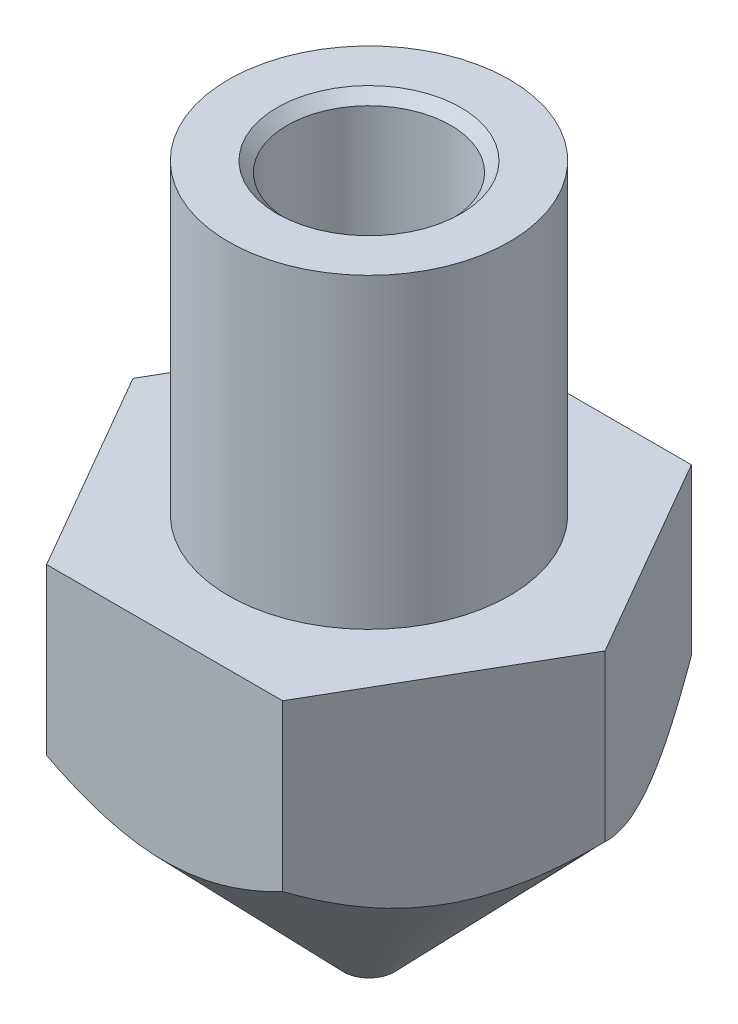
ISO-10303-21;
HEADER;
FILE_DESCRIPTION(('STEP AP214'),'2;1');
FILE_NAME('part.step','',(''),(''),'','','');
FILE_SCHEMA(('AUTOMOTIVE_DESIGN { 1 0 10303 214 1 1 1 1 }'));
ENDSEC;
DATA;
#1=APPLICATION_CONTEXT('core data for automotive mechanical design processes');
#2=APPLICATION_PROTOCOL_DEFINITION('international standard','automotive_design',2000,#1);
#3=PRODUCT_CONTEXT('',#1,'mechanical');
#4=PRODUCT('Part','Part','',(#3));
#5=PRODUCT_RELATED_PRODUCT_CATEGORY('part','',(#4));
#6=PRODUCT_DEFINITION_FORMATION('','',#4);
#7=PRODUCT_DEFINITION_CONTEXT('part definition',#1,'design');
#8=PRODUCT_DEFINITION('design','',#6,#7);
#9=PRODUCT_DEFINITION_SHAPE('','',#8);
#10=(LENGTH_UNIT() NAMED_UNIT(*) SI_UNIT(.MILLI.,.METRE.));
#11=(NAMED_UNIT(*) PLANE_ANGLE_UNIT() SI_UNIT($,.RADIAN.));
#12=(NAMED_UNIT(*) SI_UNIT($,.STERADIAN.) SOLID_ANGLE_UNIT());
#13=UNCERTAINTY_MEASURE_WITH_UNIT(LENGTH_MEASURE(1.E-05),#10,'distance_accuracy_value','');
#14=(GEOMETRIC_REPRESENTATION_CONTEXT(3) GLOBAL_UNCERTAINTY_ASSIGNED_CONTEXT((#13)) GLOBAL_UNIT_ASSIGNED_CONTEXT((#10,
#11,#12)) REPRESENTATION_CONTEXT('',''));
#15=CARTESIAN_POINT('',(0.,0.,0.));
#16=DIRECTION('',(0.,0.,1.));
#17=DIRECTION('',(1.,0.,0.));
#18=AXIS2_PLACEMENT_3D('',#15,#16,#17);
#19=CARTESIAN_POINT('',(0.,0.,0.));
#20=DIRECTION('',(0.,1.,0.));
#21=DIRECTION('',(0.,0.,1.));
#22=AXIS2_PLACEMENT_3D('',#19,#20,#21);
#23=CONICAL_SURFACE('',#22,0.5,0.767944870877507);
#24=CARTESIAN_POINT('',(0.,0.,0.));
#25=DIRECTION('',(0.,-1.,0.));
#26=DIRECTION('',(0.,0.,-1.));
#27=AXIS2_PLACEMENT_3D('',#24,#25,#26);
#28=CIRCLE('',#27,0.5);
#29=CARTESIAN_POINT('',(0.,0.,-0.5));
#30=VERTEX_POINT('',#29);
#31=EDGE_CURVE('E180',#30,#30,#28,.T.);
#32=ORIENTED_EDGE('',*,*,#31,.F.);
#33=EDGE_LOOP('',(#32));
#34=FACE_BOUND('',#33,.T.);
#35=CARTESIAN_POINT('',(-5.83092172087579,6.80451414702023,-4.));
#36=CARTESIAN_POINT('',(-5.71735019996931,6.70754417287104,-4.));
#37=CARTESIAN_POINT('',(-5.60333918837278,6.61108457604268,-4.));
#38=CARTESIAN_POINT('',(-5.37428212111084,6.41938523936363,-4.));
#39=CARTESIAN_POINT('',(-5.25923598782585,6.32414559231196,-4.));
#40=CARTESIAN_POINT('',(-5.02771232762197,6.13488956199301,-4.));
#41=CARTESIAN_POINT('',(-4.91123218432542,6.04087637391336,-4.));
#42=CARTESIAN_POINT('',(-4.67691097801347,5.85456386845405,-4.));
#43=CARTESIAN_POINT('',(-4.5590699417134,5.76226451752297,-4.));
#44=CARTESIAN_POINT('',(-4.31726898726601,5.57622409198879,-4.));
#45=CARTESIAN_POINT('',(-4.19324743657495,5.48256292259419,-4.));
#46=CARTESIAN_POINT('',(-3.94321377460085,5.29793843119599,-4.));
#47=CARTESIAN_POINT('',(-3.81720172723547,5.2069750228323,-4.));
#48=CARTESIAN_POINT('',(-3.56293813164125,5.02844484873786,-4.));
#49=CARTESIAN_POINT('',(-3.43468852451846,4.94087533240978,-4.));
#50=CARTESIAN_POINT('',(-3.17546219551015,4.76988932975329,-4.));
#51=CARTESIAN_POINT('',(-3.04448566807753,4.6864725487278,-4.));
#52=CARTESIAN_POINT('',(-2.76313496282805,4.51500321007929,-4.));
#53=CARTESIAN_POINT('',(-2.61234188100647,4.42762435220452,-4.));
#54=CARTESIAN_POINT('',(-2.30610197398595,4.26152202916953,-4.));
#55=CARTESIAN_POINT('',(-2.15065362770275,4.18280143319145,-4.));
#56=CARTESIAN_POINT('',(-1.67933290496492,3.9652439332767,-4.));
#57=CARTESIAN_POINT('',(-1.35497893301788,3.84273125951961,-4.));
#58=CARTESIAN_POINT('',(-0.927938803833649,3.73331858724004,-4.));
#59=CARTESIAN_POINT('',(-0.833805571152803,3.71228947138424,-4.));
#60=CARTESIAN_POINT('',(-0.644350787560497,3.67664708891024,-4.));
#61=CARTESIAN_POINT('',(-0.549029751182431,3.66203113722843,-4.));
#62=CARTESIAN_POINT('',(-0.353401899052962,3.63922074510874,-4.));
#63=CARTESIAN_POINT('',(-0.253058820458088,3.63133387162626,-4.));
#64=CARTESIAN_POINT('',(-0.0520614584539374,3.62340152273462,-4.));
#65=CARTESIAN_POINT('',(0.0485928199320583,3.62335592140832,-4.));
#66=CARTESIAN_POINT('',(0.249543780217588,3.63110699959155,-4.));
#67=CARTESIAN_POINT('',(0.349840622751916,3.6388995419884,-4.));
#68=CARTESIAN_POINT('',(0.549562272683146,3.66200244367996,-4.));
#69=CARTESIAN_POINT('',(0.648986957434902,3.6773138435781,-4.));
#70=CARTESIAN_POINT('',(0.895443062431706,3.72421614442163,-4.));
#71=CARTESIAN_POINT('',(1.04166200046331,3.76011408004584,-4.));
#72=CARTESIAN_POINT('',(1.33022907239606,3.8450396604516,-4.));
#73=CARTESIAN_POINT('',(1.47257478792436,3.89407530996351,-4.));
#74=CARTESIAN_POINT('',(1.75490117556697,4.00340238370303,-4.));
#75=CARTESIAN_POINT('',(1.89482927233845,4.06382814348894,-4.));
#76=CARTESIAN_POINT('',(2.1016417292314,4.16085298752962,-4.));
#77=CARTESIAN_POINT('',(2.17005832988657,4.19425480912722,-4.));
#78=CARTESIAN_POINT('',(2.30593226081484,4.2629553087002,-4.));
#79=CARTESIAN_POINT('',(2.37338961153632,4.29825394616418,-4.));
#80=CARTESIAN_POINT('',(2.5631025490632,4.40056871932972,-4.));
#81=CARTESIAN_POINT('',(2.68429495937809,4.46955819556944,-4.));
#82=CARTESIAN_POINT('',(2.92400799289134,4.61205124192391,-4.));
#83=CARTESIAN_POINT('',(3.04252806215679,4.68555573638032,-4.));
#84=CARTESIAN_POINT('',(3.27730565688129,4.83626094690872,-4.));
#85=CARTESIAN_POINT('',(3.39356151314026,4.91346425474781,-4.));
#86=CARTESIAN_POINT('',(3.62404017068924,5.07085481246826,-4.));
#87=CARTESIAN_POINT('',(3.73826281309247,5.15104229404955,-4.));
#88=CARTESIAN_POINT('',(4.07923386706226,5.3959326308836,-4.));
#89=CARTESIAN_POINT('',(4.30332491717046,5.5643344519436,-4.));
#90=CARTESIAN_POINT('',(4.74609427839567,5.90786638018397,-4.));
#91=CARTESIAN_POINT('',(4.96477464788648,6.08299386195405,-4.));
#92=CARTESIAN_POINT('',(5.37912326062103,6.42263677002468,-4.));
#93=CARTESIAN_POINT('',(5.57513068079329,6.58673978361731,-4.));
#94=CARTESIAN_POINT('',(5.96449275237983,6.918098815058,-4.));
#95=CARTESIAN_POINT('',(6.15784710285718,7.08535518556491,-4.));
#96=CARTESIAN_POINT('',(6.54062275535227,7.42073543326468,-4.));
#97=CARTESIAN_POINT('',(6.73006391824147,7.5888366960026,-4.));
#98=CARTESIAN_POINT('',(7.10717873878646,7.92693496794005,-4.));
#99=CARTESIAN_POINT('',(7.29485274842942,8.09693158422518,-4.));
#100=CARTESIAN_POINT('',(7.48184847896607,8.26766186002392,-4.));
#101=B_SPLINE_CURVE_WITH_KNOTS('',3,(#35,#36,#37,#38,#39,#40,#41,#42,#43,#44,#45,#46,#47,#48,
#49,#50,#51,#52,#53,#54,#55,#56,#57,#58,#59,#60,#61,#62,#63,#64,#65,#66,#67,#68,#69,#70,#71,#72,
#73,#74,#75,#76,#77,#78,#79,#80,#81,#82,#83,#84,#85,#86,#87,#88,#89,#90,#91,#92,#93,#94,#95,#96,
#97,#98,#99,#100),.UNSPECIFIED.,.F.,.F.,(4,2,2,2,2,2,2,2,2,2,2,2,2,2,2,2,2,2,2,2,2,2,2,2,2,2,2,
2,2,2,2,2,4),(0.,0.448014955500507,0.896063790554634,1.3451100592186,1.79414752771028,
2.26036159191939,2.72656071564975,3.19237374890787,3.65815367868591,4.18069022660586,
4.70339941470861,5.7363308565061,6.02551524403133,6.31457844003722,6.6162374565168,
6.91789162887906,7.21938666627068,7.52092344208241,7.97181746782208,8.42298684783357,
8.87985436823071,9.10823620281689,9.33661316165653,9.75483946538847,10.1731516781548,
10.5917614170776,11.010403726167,11.8511292712344,12.6915299038938,13.4583892828347,
14.2253349390667,14.9851324687841,15.7447753145092),.UNSPECIFIED.);
#102=CARTESIAN_POINT('',(-2.3094010767585,4.26514448647272,-4.));
#103=VERTEX_POINT('',#102);
#104=CARTESIAN_POINT('',(2.3094010767585,4.26514448647272,-4.));
#105=VERTEX_POINT('',#104);
#106=EDGE_CURVE('E122',#103,#105,#101,.T.);
#107=ORIENTED_EDGE('',*,*,#106,.T.);
#108=CARTESIAN_POINT('',(2.30928560670466,4.26526406369767,-4.0002));
#109=CARTESIAN_POINT('',(2.34782211681846,4.22536226357573,-3.93345280653652));
#110=CARTESIAN_POINT('',(2.38666108492066,4.18663148012954,-3.86618174046996));
#111=CARTESIAN_POINT('',(2.46500687081153,4.11186714373337,-3.73048285874805));
#112=CARTESIAN_POINT('',(2.5045140327655,4.07583503606693,-3.66205444698093));
#113=CARTESIAN_POINT('',(2.62451128762482,3.97200066335801,-3.45421310479579));
#114=CARTESIAN_POINT('',(2.70605152011892,3.90891058753372,-3.31298127925504));
#115=CARTESIAN_POINT('',(2.87061839879567,3.79990979509531,-3.02794308414388));
#116=CARTESIAN_POINT('',(2.9536032607487,3.75375117793495,-2.88420908698214));
#117=CARTESIAN_POINT('',(3.12156896494858,3.68124550025721,-2.59328395337886));
#118=CARTESIAN_POINT('',(3.20654416398577,3.65484810835954,-2.44610259126317));
#119=CARTESIAN_POINT('',(3.35177692207373,3.62904173620562,-2.19455207533146));
#120=CARTESIAN_POINT('',(3.41178844602967,3.62390625874003,-2.09060906680015));
#121=CARTESIAN_POINT('',(3.53181335928835,3.62486732352844,-1.88271981886206));
#122=CARTESIAN_POINT('',(3.59182674338555,3.63096735350604,-1.77877358847156));
#123=CARTESIAN_POINT('',(3.71138072489047,3.65407137916736,-1.57170001825789));
#124=CARTESIAN_POINT('',(3.77092074862927,3.67108701840305,-1.46857367205843));
#125=CARTESIAN_POINT('',(3.88905265931392,3.71511269701236,-1.26396320075743));
#126=CARTESIAN_POINT('',(3.94764460982955,3.74212206336837,-1.1624789655498));
#127=CARTESIAN_POINT('',(4.05895017913803,3.80236675521796,-0.969692064342143));
#128=CARTESIAN_POINT('',(4.11175689960454,3.83492463543376,-0.878228141513056));
#129=CARTESIAN_POINT('',(4.21628382691398,3.90643145599088,-0.697182192654049));
#130=CARTESIAN_POINT('',(4.26800375854891,3.9453819936614,-0.607600643298352));
#131=CARTESIAN_POINT('',(4.37022696173718,4.02860468036939,-0.430544861663835));
#132=CARTESIAN_POINT('',(4.42073251326408,4.07286573909606,-0.343066680354955));
#133=CARTESIAN_POINT('',(4.52063120369249,4.16589000797576,-0.170037072923358));
#134=CARTESIAN_POINT('',(4.57002551741183,4.21464815577587,-0.0844836119564646));
#135=CARTESIAN_POINT('',(4.61891762357084,4.26526406369767,0.000200000000000419));
#136=B_SPLINE_CURVE_WITH_KNOTS('',3,(#108,#109,#110,#111,#112,#113,#114,#115,#116,#117,#118,
#119,#120,#121,#122,#123,#124,#125,#126,#127,#128,#129,#130,#131,#132,#133,#134,#135),
.UNSPECIFIED.,.F.,.F.,(4,2,2,2,2,2,2,2,2,2,2,2,2,4),(0.,0.260348804382028,0.520836056824744,
1.04469268588743,1.56054031653382,2.07506958288115,2.43497491323251,2.79499198414201,
3.15539372102648,3.51577119143047,3.84709643355895,4.17850459010681,4.50923231289275,
4.83959217804411),.UNSPECIFIED.);
#137=CARTESIAN_POINT('',(4.61880215351701,4.26514448647272,0.));
#138=VERTEX_POINT('',#137);
#139=EDGE_CURVE('E158',#105,#138,#136,.T.);
#140=ORIENTED_EDGE('',*,*,#139,.T.);
#141=CARTESIAN_POINT('',(4.61891762357084,4.26526406369767,-0.0002));
#142=CARTESIAN_POINT('',(4.58038111345705,4.22536226357573,0.0665471934634804));
#143=CARTESIAN_POINT('',(4.54154214535485,4.18663148012954,0.133818259530037));
#144=CARTESIAN_POINT('',(4.46319635946397,4.11186714373338,0.26951714125195));
#145=CARTESIAN_POINT('',(4.42368919751001,4.07583503606693,0.337945553019075));
#146=CARTESIAN_POINT('',(4.30369194265069,3.97200066335801,0.545786895204212));
#147=CARTESIAN_POINT('',(4.22215171015659,3.90891058753372,0.687018720744959));
#148=CARTESIAN_POINT('',(4.05758483147983,3.79990979509532,0.972056915856126));
#149=CARTESIAN_POINT('',(3.9745999695268,3.75375117793495,1.11579091301787));
#150=CARTESIAN_POINT('',(3.80663426532693,3.68124550025721,1.40671604662114));
#151=CARTESIAN_POINT('',(3.72165906628973,3.65484810835955,1.55389740873683));
#152=CARTESIAN_POINT('',(3.57642630820177,3.62904173620562,1.80544792466854));
#153=CARTESIAN_POINT('',(3.51641478424584,3.62390625874003,1.90939093319985));
#154=CARTESIAN_POINT('',(3.39638987098716,3.62486732352844,2.11728018113794));
#155=CARTESIAN_POINT('',(3.33637648688996,3.63096735350604,2.22122641152844));
#156=CARTESIAN_POINT('',(3.21682250538504,3.65407137916736,2.42829998174211));
#157=CARTESIAN_POINT('',(3.15728248164623,3.67108701840305,2.53142632794157));
#158=CARTESIAN_POINT('',(3.03915057096159,3.71511269701236,2.73603679924257));
#159=CARTESIAN_POINT('',(2.98055862044596,3.74212206336837,2.8375210344502));
#160=CARTESIAN_POINT('',(2.86925305113748,3.80236675521796,3.03030793565786));
#161=CARTESIAN_POINT('',(2.81644633067097,3.83492463543376,3.12177185848695));
#162=CARTESIAN_POINT('',(2.71191940336153,3.90643145599088,3.30281780734595));
#163=CARTESIAN_POINT('',(2.6601994717266,3.9453819936614,3.39239935670165));
#164=CARTESIAN_POINT('',(2.55797626853833,4.02860468036939,3.56945513833616));
#165=CARTESIAN_POINT('',(2.50747071701143,4.07286573909607,3.65693331964504));
#166=CARTESIAN_POINT('',(2.40757202658302,4.16589000797576,3.82996292707664));
#167=CARTESIAN_POINT('',(2.35817771286368,4.21464815577587,3.91551638804353));
#168=CARTESIAN_POINT('',(2.30928560670467,4.26526406369767,4.0002));
#169=B_SPLINE_CURVE_WITH_KNOTS('',3,(#141,#142,#143,#144,#145,#146,#147,#148,#149,#150,#151,
#152,#153,#154,#155,#156,#157,#158,#159,#160,#161,#162,#163,#164,#165,#166,#167,#168),
.UNSPECIFIED.,.F.,.F.,(4,2,2,2,2,2,2,2,2,2,2,2,2,4),(0.,0.260348804382028,0.520836056824744,
1.04469268588743,1.56054031653382,2.07506958288114,2.43497491323251,2.79499198414201,
3.15539372102648,3.51577119143046,3.84709643355895,4.1785045901068,4.50923231289275,
4.8395921780441),.UNSPECIFIED.);
#170=CARTESIAN_POINT('',(2.30940107675851,4.26514448647272,4.));
#171=VERTEX_POINT('',#170);
#172=EDGE_CURVE('E166',#138,#171,#169,.T.);
#173=ORIENTED_EDGE('',*,*,#172,.T.);
#174=CARTESIAN_POINT('',(-5.83092172087579,6.80451414702023,4.));
#175=CARTESIAN_POINT('',(-5.7173501999693,6.70754417287104,4.));
#176=CARTESIAN_POINT('',(-5.60333918837277,6.61108457604267,4.));
#177=CARTESIAN_POINT('',(-5.37428212111083,6.41938523936363,4.));
#178=CARTESIAN_POINT('',(-5.25923598782584,6.32414559231195,4.));
#179=CARTESIAN_POINT('',(-5.02771232762197,6.13488956199301,4.));
#180=CARTESIAN_POINT('',(-4.91123218432542,6.04087637391335,4.));
#181=CARTESIAN_POINT('',(-4.67691097801347,5.85456386845405,4.));
#182=CARTESIAN_POINT('',(-4.5590699417134,5.76226451752297,4.));
#183=CARTESIAN_POINT('',(-4.31726898726601,5.57622409198878,4.));
#184=CARTESIAN_POINT('',(-4.19324743657495,5.48256292259419,4.));
#185=CARTESIAN_POINT('',(-3.94321377460085,5.29793843119599,4.));
#186=CARTESIAN_POINT('',(-3.81720172723546,5.20697502283229,4.));
#187=CARTESIAN_POINT('',(-3.56293813164124,5.02844484873785,4.));
#188=CARTESIAN_POINT('',(-3.43468852451846,4.94087533240978,4.));
#189=CARTESIAN_POINT('',(-3.17546219551015,4.76988932975329,4.));
#190=CARTESIAN_POINT('',(-3.04448566807753,4.6864725487278,4.));
#191=CARTESIAN_POINT('',(-2.76313496282805,4.51500321007929,4.));
#192=CARTESIAN_POINT('',(-2.61234188100647,4.42762435220452,4.));
#193=CARTESIAN_POINT('',(-2.30610197398594,4.26152202916953,4.));
#194=CARTESIAN_POINT('',(-2.15065362770274,4.18280143319145,4.));
#195=CARTESIAN_POINT('',(-1.67933290496492,3.9652439332767,4.));
#196=CARTESIAN_POINT('',(-1.35497893301788,3.84273125951961,4.));
#197=CARTESIAN_POINT('',(-0.927938803833645,3.73331858724003,4.));
#198=CARTESIAN_POINT('',(-0.833805571152798,3.71228947138424,4.));
#199=CARTESIAN_POINT('',(-0.644350787560493,3.67664708891024,4.));
#200=CARTESIAN_POINT('',(-0.549029751182427,3.66203113722843,4.));
#201=CARTESIAN_POINT('',(-0.353401899052958,3.63922074510873,4.));
#202=CARTESIAN_POINT('',(-0.253058820458084,3.63133387162626,4.));
#203=CARTESIAN_POINT('',(-0.0520614584539331,3.62340152273462,4.));
#204=CARTESIAN_POINT('',(0.0485928199320622,3.62335592140831,4.));
#205=CARTESIAN_POINT('',(0.249543780217591,3.63110699959155,4.));
#206=CARTESIAN_POINT('',(0.349840622751919,3.6388995419884,4.));
#207=CARTESIAN_POINT('',(0.54956227268315,3.66200244367996,4.));
#208=CARTESIAN_POINT('',(0.648986957434905,3.6773138435781,4.));
#209=CARTESIAN_POINT('',(0.895443062431709,3.72421614442163,4.));
#210=CARTESIAN_POINT('',(1.04166200046332,3.76011408004584,4.));
#211=CARTESIAN_POINT('',(1.33022907239606,3.8450396604516,4.));
#212=CARTESIAN_POINT('',(1.47257478792437,3.89407530996351,4.));
#213=CARTESIAN_POINT('',(1.75490117556697,4.00340238370303,4.));
#214=CARTESIAN_POINT('',(1.89482927233845,4.06382814348894,4.));
#215=CARTESIAN_POINT('',(2.1016417292314,4.16085298752962,4.));
#216=CARTESIAN_POINT('',(2.17005832988657,4.19425480912722,4.));
#217=CARTESIAN_POINT('',(2.30593226081485,4.2629553087002,4.));
#218=CARTESIAN_POINT('',(2.37338961153632,4.29825394616418,4.));
#219=CARTESIAN_POINT('',(2.5631025490632,4.40056871932972,4.));
#220=CARTESIAN_POINT('',(2.6842949593781,4.46955819556944,4.));
#221=CARTESIAN_POINT('',(2.92400799289134,4.6120512419239,4.));
#222=CARTESIAN_POINT('',(3.04252806215679,4.68555573638032,4.));
#223=CARTESIAN_POINT('',(3.2773056568813,4.83626094690871,4.));
#224=CARTESIAN_POINT('',(3.39356151314027,4.91346425474781,4.));
#225=CARTESIAN_POINT('',(3.62404017068924,5.07085481246826,4.));
#226=CARTESIAN_POINT('',(3.73826281309247,5.15104229404955,4.));
#227=CARTESIAN_POINT('',(4.07923386706226,5.3959326308836,4.));
#228=CARTESIAN_POINT('',(4.30332491717046,5.5643344519436,4.));
#229=CARTESIAN_POINT('',(4.74609427839567,5.90786638018397,4.));
#230=CARTESIAN_POINT('',(4.96477464788648,6.08299386195405,4.));
#231=CARTESIAN_POINT('',(5.37912326062103,6.42263677002468,4.));
#232=CARTESIAN_POINT('',(5.57513068079329,6.5867397836173,4.));
#233=CARTESIAN_POINT('',(5.96449275237983,6.918098815058,4.));
#234=CARTESIAN_POINT('',(6.15784710285718,7.08535518556491,4.));
#235=CARTESIAN_POINT('',(6.54062275535227,7.42073543326468,4.));
#236=CARTESIAN_POINT('',(6.73006391824147,7.5888366960026,4.));
#237=CARTESIAN_POINT('',(7.10717873878646,7.92693496794005,4.));
#238=CARTESIAN_POINT('',(7.29485274842942,8.09693158422518,4.));
#239=CARTESIAN_POINT('',(7.48184847896607,8.26766186002392,4.));
#240=B_SPLINE_CURVE_WITH_KNOTS('',3,(#174,#175,#176,#177,#178,#179,#180,#181,#182,#183,#184,
#185,#186,#187,#188,#189,#190,#191,#192,#193,#194,#195,#196,#197,#198,#199,#200,#201,#202,#203,
#204,#205,#206,#207,#208,#209,#210,#211,#212,#213,#214,#215,#216,#217,#218,#219,#220,#221,#222,
#223,#224,#225,#226,#227,#228,#229,#230,#231,#232,#233,#234,#235,#236,#237,#238,#239),
.UNSPECIFIED.,.F.,.F.,(4,2,2,2,2,2,2,2,2,2,2,2,2,2,2,2,2,2,2,2,2,2,2,2,2,2,2,2,2,2,2,2,4),(0.,
0.448014955500507,0.896063790554633,1.3451100592186,1.79414752771028,2.26036159191938,
2.72656071564975,3.19237374890786,3.65815367868591,4.18069022660586,4.70339941470861,
5.73633085650609,6.02551524403132,6.31457844003722,6.6162374565168,6.91789162887906,
7.21938666627068,7.52092344208241,7.97181746782207,8.42298684783357,8.87985436823071,
9.10823620281689,9.33661316165653,9.75483946538847,10.1731516781548,10.5917614170776,
11.010403726167,11.8511292712344,12.6915299038938,13.4583892828347,14.2253349390667,
14.9851324687841,15.7447753145092),.UNSPECIFIED.);
#241=CARTESIAN_POINT('',(-2.3094010767585,4.26514448647272,4.));
#242=VERTEX_POINT('',#241);
#243=EDGE_CURVE('E212',#171,#242,#240,.F.);
#244=ORIENTED_EDGE('',*,*,#243,.T.);
#245=CARTESIAN_POINT('',(-2.30928560670466,4.26526406369767,4.0002));
#246=CARTESIAN_POINT('',(-2.34782211681846,4.22536226357573,3.93345280653652));
#247=CARTESIAN_POINT('',(-2.38666108492066,4.18663148012954,3.86618174046996));
#248=CARTESIAN_POINT('',(-2.46500687081153,4.11186714373337,3.73048285874805));
#249=CARTESIAN_POINT('',(-2.5045140327655,4.07583503606692,3.66205444698092));
#250=CARTESIAN_POINT('',(-2.62451128762482,3.97200066335801,3.45421310479579));
#251=CARTESIAN_POINT('',(-2.70605152011892,3.90891058753372,3.31298127925504));
#252=CARTESIAN_POINT('',(-2.87061839879567,3.79990979509531,3.02794308414387));
#253=CARTESIAN_POINT('',(-2.95360326074871,3.75375117793495,2.88420908698213));
#254=CARTESIAN_POINT('',(-3.12156896494858,3.68124550025721,2.59328395337886));
#255=CARTESIAN_POINT('',(-3.20654416398577,3.65484810835954,2.44610259126317));
#256=CARTESIAN_POINT('',(-3.35177692207373,3.62904173620561,2.19455207533146));
#257=CARTESIAN_POINT('',(-3.41178844602967,3.62390625874003,2.09060906680015));
#258=CARTESIAN_POINT('',(-3.53181335928835,3.62486732352844,1.88271981886206));
#259=CARTESIAN_POINT('',(-3.59182674338555,3.63096735350604,1.77877358847156));
#260=CARTESIAN_POINT('',(-3.71138072489047,3.65407137916736,1.57170001825789));
#261=CARTESIAN_POINT('',(-3.77092074862928,3.67108701840305,1.46857367205843));
#262=CARTESIAN_POINT('',(-3.88905265931392,3.71511269701236,1.26396320075743));
#263=CARTESIAN_POINT('',(-3.94764460982955,3.74212206336837,1.1624789655498));
#264=CARTESIAN_POINT('',(-4.05895017913803,3.80236675521796,0.969692064342141));
#265=CARTESIAN_POINT('',(-4.11175689960454,3.83492463543376,0.878228141513054));
#266=CARTESIAN_POINT('',(-4.21628382691398,3.90643145599088,0.697182192654048));
#267=CARTESIAN_POINT('',(-4.26800375854891,3.9453819936614,0.607600643298351));
#268=CARTESIAN_POINT('',(-4.37022696173718,4.02860468036939,0.430544861663834));
#269=CARTESIAN_POINT('',(-4.42073251326408,4.07286573909606,0.343066680354955));
#270=CARTESIAN_POINT('',(-4.52063120369249,4.16589000797576,0.170037072923358));
#271=CARTESIAN_POINT('',(-4.57002551741183,4.21464815577587,0.0844836119564646));
#272=CARTESIAN_POINT('',(-4.61891762357084,4.26526406369767,-0.000200000000000437));
#273=B_SPLINE_CURVE_WITH_KNOTS('',3,(#245,#246,#247,#248,#249,#250,#251,#252,#253,#254,#255,
#256,#257,#258,#259,#260,#261,#262,#263,#264,#265,#266,#267,#268,#269,#270,#271,#272),
.UNSPECIFIED.,.F.,.F.,(4,2,2,2,2,2,2,2,2,2,2,2,2,4),(0.,0.260348804382028,0.520836056824745,
1.04469268588743,1.56054031653382,2.07506958288115,2.43497491323251,2.79499198414201,
3.15539372102648,3.51577119143047,3.84709643355895,4.17850459010681,4.50923231289275,
4.83959217804411),.UNSPECIFIED.);
#274=CARTESIAN_POINT('',(-4.61880215351701,4.26514448647272,0.));
#275=VERTEX_POINT('',#274);
#276=EDGE_CURVE('E213',#242,#275,#273,.T.);
#277=ORIENTED_EDGE('',*,*,#276,.T.);
#278=CARTESIAN_POINT('',(-4.61891762357084,4.26526406369767,0.0002));
#279=CARTESIAN_POINT('',(-4.58038111345705,4.22536226357573,-0.0665471934634804));
#280=CARTESIAN_POINT('',(-4.54154214535485,4.18663148012954,-0.133818259530037));
#281=CARTESIAN_POINT('',(-4.46319635946397,4.11186714373338,-0.26951714125195));
#282=CARTESIAN_POINT('',(-4.42368919751001,4.07583503606693,-0.337945553019075));
#283=CARTESIAN_POINT('',(-4.30369194265069,3.97200066335801,-0.545786895204213));
#284=CARTESIAN_POINT('',(-4.22215171015659,3.90891058753372,-0.68701872074496));
#285=CARTESIAN_POINT('',(-4.05758483147983,3.79990979509531,-0.972056915856127));
#286=CARTESIAN_POINT('',(-3.9745999695268,3.75375117793495,-1.11579091301787));
#287=CARTESIAN_POINT('',(-3.80663426532692,3.68124550025721,-1.40671604662114));
#288=CARTESIAN_POINT('',(-3.72165906628973,3.65484810835955,-1.55389740873684));
#289=CARTESIAN_POINT('',(-3.57642630820177,3.62904173620562,-1.80544792466854));
#290=CARTESIAN_POINT('',(-3.51641478424584,3.62390625874003,-1.90939093319986));
#291=CARTESIAN_POINT('',(-3.39638987098716,3.62486732352844,-2.11728018113794));
#292=CARTESIAN_POINT('',(-3.33637648688995,3.63096735350604,-2.22122641152844));
#293=CARTESIAN_POINT('',(-3.21682250538503,3.65407137916736,-2.42829998174212));
#294=CARTESIAN_POINT('',(-3.15728248164623,3.67108701840305,-2.53142632794158));
#295=CARTESIAN_POINT('',(-3.03915057096159,3.71511269701236,-2.73603679924257));
#296=CARTESIAN_POINT('',(-2.98055862044596,3.74212206336837,-2.8375210344502));
#297=CARTESIAN_POINT('',(-2.86925305113748,3.80236675521796,-3.03030793565786));
#298=CARTESIAN_POINT('',(-2.81644633067097,3.83492463543376,-3.12177185848695));
#299=CARTESIAN_POINT('',(-2.71191940336153,3.90643145599088,-3.30281780734595));
#300=CARTESIAN_POINT('',(-2.6601994717266,3.9453819936614,-3.39239935670165));
#301=CARTESIAN_POINT('',(-2.55797626853833,4.02860468036939,-3.56945513833617));
#302=CARTESIAN_POINT('',(-2.50747071701143,4.07286573909606,-3.65693331964505));
#303=CARTESIAN_POINT('',(-2.40757202658302,4.16589000797576,-3.82996292707664));
#304=CARTESIAN_POINT('',(-2.35817771286368,4.21464815577587,-3.91551638804353));
#305=CARTESIAN_POINT('',(-2.30928560670467,4.26526406369767,-4.0002));
#306=B_SPLINE_CURVE_WITH_KNOTS('',3,(#278,#279,#280,#281,#282,#283,#284,#285,#286,#287,#288,
#289,#290,#291,#292,#293,#294,#295,#296,#297,#298,#299,#300,#301,#302,#303,#304,#305),
.UNSPECIFIED.,.F.,.F.,(4,2,2,2,2,2,2,2,2,2,2,2,2,4),(0.,0.260348804382028,0.520836056824745,
1.04469268588743,1.56054031653382,2.07506958288115,2.43497491323251,2.79499198414201,
3.15539372102648,3.51577119143047,3.84709643355895,4.17850459010681,4.50923231289275,
4.8395921780441),.UNSPECIFIED.);
#307=EDGE_CURVE('E92',#275,#103,#306,.T.);
#308=ORIENTED_EDGE('',*,*,#307,.T.);
#309=EDGE_LOOP('',(#107,#140,#173,#244,#277,#308));
#310=FACE_BOUND('',#309,.T.);
#311=ADVANCED_FACE('F36',(#34,#310),#23,.T.);
#312=CARTESIAN_POINT('',(7.74266581105308,7.5,0.));
#313=DIRECTION('',(0.,1.,0.));
#314=DIRECTION('',(0.,0.,1.));
#315=AXIS2_PLACEMENT_3D('',#312,#313,#314);
#316=PLANE('',#315);
#317=CARTESIAN_POINT('',(0.,7.5,0.));
#318=DIRECTION('',(0.,-1.,0.));
#319=DIRECTION('',(0.,0.,-1.));
#320=AXIS2_PLACEMENT_3D('',#317,#318,#319);
#321=CIRCLE('',#320,2.75);
#322=CARTESIAN_POINT('',(0.,7.5,-2.75));
#323=VERTEX_POINT('',#322);
#324=EDGE_CURVE('E177',#323,#323,#321,.T.);
#325=ORIENTED_EDGE('',*,*,#324,.T.);
#326=EDGE_LOOP('',(#325));
#327=FACE_BOUND('',#326,.T.);
#328=DIRECTION('',(0.5,0.,-0.866025403784439));
#329=VECTOR('',#328,1.);
#330=CARTESIAN_POINT('',(2.30940107675851,7.5,4.));
#331=LINE('',#330,#329);
#332=CARTESIAN_POINT('',(2.30940107675851,7.5,4.));
#333=VERTEX_POINT('',#332);
#334=CARTESIAN_POINT('',(4.61880215351701,7.5,0.));
#335=VERTEX_POINT('',#334);
#336=EDGE_CURVE('E118',#333,#335,#331,.T.);
#337=ORIENTED_EDGE('',*,*,#336,.T.);
#338=DIRECTION('',(-0.5,0.,-0.866025403784438));
#339=VECTOR('',#338,1.);
#340=CARTESIAN_POINT('',(4.61880215351701,7.5,0.));
#341=LINE('',#340,#339);
#342=CARTESIAN_POINT('',(2.3094010767585,7.5,-4.));
#343=VERTEX_POINT('',#342);
#344=EDGE_CURVE('E113',#335,#343,#341,.T.);
#345=ORIENTED_EDGE('',*,*,#344,.T.);
#346=DIRECTION('',(-1.,0.,0.));
#347=VECTOR('',#346,1.);
#348=CARTESIAN_POINT('',(2.3094010767585,7.5,-4.));
#349=LINE('',#348,#347);
#350=CARTESIAN_POINT('',(-2.3094010767585,7.5,-4.));
#351=VERTEX_POINT('',#350);
#352=EDGE_CURVE('E111',#343,#351,#349,.T.);
#353=ORIENTED_EDGE('',*,*,#352,.T.);
#354=DIRECTION('',(-0.5,0.,0.866025403784438));
#355=VECTOR('',#354,1.);
#356=CARTESIAN_POINT('',(-2.3094010767585,7.5,-4.));
#357=LINE('',#356,#355);
#358=CARTESIAN_POINT('',(-4.61880215351701,7.5,0.));
#359=VERTEX_POINT('',#358);
#360=EDGE_CURVE('E59',#351,#359,#357,.T.);
#361=ORIENTED_EDGE('',*,*,#360,.T.);
#362=DIRECTION('',(0.500000000000001,0.,0.866025403784438));
#363=VECTOR('',#362,1.);
#364=CARTESIAN_POINT('',(-4.61880215351701,7.5,0.));
#365=LINE('',#364,#363);
#366=CARTESIAN_POINT('',(-2.3094010767585,7.5,4.));
#367=VERTEX_POINT('',#366);
#368=EDGE_CURVE('E99',#359,#367,#365,.T.);
#369=ORIENTED_EDGE('',*,*,#368,.T.);
#370=DIRECTION('',(1.,0.,0.));
#371=VECTOR('',#370,1.);
#372=CARTESIAN_POINT('',(-2.3094010767585,7.5,4.));
#373=LINE('',#372,#371);
#374=EDGE_CURVE('E105',#367,#333,#373,.T.);
#375=ORIENTED_EDGE('',*,*,#374,.T.);
#376=EDGE_LOOP('',(#337,#345,#353,#361,#369,#375));
#377=FACE_BOUND('',#376,.T.);
#378=ADVANCED_FACE('F109',(#327,#377),#316,.T.);
#379=CARTESIAN_POINT('',(0.,2.42487113059646,0.));
#380=DIRECTION('',(0.,1.,0.));
#381=DIRECTION('',(0.,0.,1.));
#382=AXIS2_PLACEMENT_3D('',#379,#380,#381);
#383=CONICAL_SURFACE('',#382,1.6,0.523598775598293);
#384=CARTESIAN_POINT('',(0.,0.,0.));
#385=DIRECTION('',(0.,-1.,0.));
#386=DIRECTION('',(0.,0.,-1.));
#387=AXIS2_PLACEMENT_3D('',#384,#385,#386);
#388=CIRCLE('',#387,0.2);
#389=CARTESIAN_POINT('',(0.,0.,0.2));
#390=VERTEX_POINT('',#389);
#391=EDGE_CURVE('E183',#390,#390,#388,.T.);
#392=CARTESIAN_POINT('',(0.,2.42487113059646,0.));
#393=DIRECTION('',(0.,-1.,0.));
#394=DIRECTION('',(0.,0.,-1.));
#395=AXIS2_PLACEMENT_3D('',#392,#393,#394);
#396=CIRCLE('',#395,1.6);
#397=CARTESIAN_POINT('',(0.,2.42487113059646,1.6));
#398=VERTEX_POINT('',#397);
#399=EDGE_CURVE('E165',#398,#398,#396,.T.);
#400=CARTESIAN_POINT('',(0.,0.,0.2));
#401=CARTESIAN_POINT('',(0.,0.0252590742770464,0.214583333333333));
#402=CARTESIAN_POINT('',(0.,0.0505181485540929,0.229166666666667));
#403=CARTESIAN_POINT('',(0.,0.101036297108186,0.258333333333333));
#404=CARTESIAN_POINT('',(0.,0.126295371385233,0.272916666666667));
#405=CARTESIAN_POINT('',(0.,0.176813519939326,0.302083333333333));
#406=CARTESIAN_POINT('',(0.,0.202072594216372,0.316666666666667));
#407=CARTESIAN_POINT('',(0.,0.252590742770465,0.345833333333333));
#408=CARTESIAN_POINT('',(0.,0.277849817047512,0.360416666666667));
#409=CARTESIAN_POINT('',(0.,0.328367965601605,0.389583333333333));
#410=CARTESIAN_POINT('',(0.,0.353627039878651,0.404166666666667));
#411=CARTESIAN_POINT('',(0.,0.404145188432744,0.433333333333333));
#412=CARTESIAN_POINT('',(0.,0.429404262709791,0.447916666666667));
#413=CARTESIAN_POINT('',(0.,0.479922411263884,0.477083333333333));
#414=CARTESIAN_POINT('',(0.,0.50518148554093,0.491666666666667));
#415=CARTESIAN_POINT('',(0.,0.555699634095023,0.520833333333334));
#416=CARTESIAN_POINT('',(0.,0.58095870837207,0.535416666666667));
#417=CARTESIAN_POINT('',(0.,0.631476856926163,0.564583333333334));
#418=CARTESIAN_POINT('',(0.,0.656735931203209,0.579166666666667));
#419=CARTESIAN_POINT('',(0.,0.707254079757302,0.608333333333334));
#420=CARTESIAN_POINT('',(0.,0.732513154034349,0.622916666666667));
#421=CARTESIAN_POINT('',(0.,0.783031302588442,0.652083333333334));
#422=CARTESIAN_POINT('',(0.,0.808290376865488,0.666666666666667));
#423=CARTESIAN_POINT('',(0.,0.858808525419581,0.695833333333334));
#424=CARTESIAN_POINT('',(0.,0.884067599696628,0.710416666666667));
#425=CARTESIAN_POINT('',(0.,0.934585748250721,0.739583333333334));
#426=CARTESIAN_POINT('',(0.,0.959844822527767,0.754166666666667));
#427=CARTESIAN_POINT('',(0.,1.01036297108186,0.783333333333334));
#428=CARTESIAN_POINT('',(0.,1.03562204535891,0.797916666666667));
#429=CARTESIAN_POINT('',(0.,1.086140193913,0.827083333333334));
#430=CARTESIAN_POINT('',(0.,1.11139926819005,0.841666666666667));
#431=CARTESIAN_POINT('',(0.,1.16191741674414,0.870833333333334));
#432=CARTESIAN_POINT('',(0.,1.18717649102119,0.885416666666667));
#433=CARTESIAN_POINT('',(0.,1.23769463957528,0.914583333333334));
#434=CARTESIAN_POINT('',(0.,1.26295371385233,0.929166666666667));
#435=CARTESIAN_POINT('',(0.,1.31347186240642,0.958333333333334));
#436=CARTESIAN_POINT('',(0.,1.33873093668347,0.972916666666668));
#437=CARTESIAN_POINT('',(0.,1.38924908523756,1.00208333333333));
#438=CARTESIAN_POINT('',(0.,1.4145081595146,1.01666666666667));
#439=CARTESIAN_POINT('',(0.,1.4650263080687,1.04583333333333));
#440=CARTESIAN_POINT('',(0.,1.49028538234574,1.06041666666667));
#441=CARTESIAN_POINT('',(0.,1.54080353089984,1.08958333333333));
#442=CARTESIAN_POINT('',(0.,1.56606260517688,1.10416666666667));
#443=CARTESIAN_POINT('',(0.,1.61658075373098,1.13333333333333));
#444=CARTESIAN_POINT('',(0.,1.64183982800802,1.14791666666667));
#445=CARTESIAN_POINT('',(0.,1.69235797656212,1.17708333333333));
#446=CARTESIAN_POINT('',(0.,1.71761705083916,1.19166666666667));
#447=CARTESIAN_POINT('',(0.,1.76813519939326,1.22083333333333));
#448=CARTESIAN_POINT('',(0.,1.7933942736703,1.23541666666667));
#449=CARTESIAN_POINT('',(0.,1.8439124222244,1.26458333333333));
#450=CARTESIAN_POINT('',(0.,1.86917149650144,1.27916666666667));
#451=CARTESIAN_POINT('',(0.,1.91968964505553,1.30833333333333));
#452=CARTESIAN_POINT('',(0.,1.94494871933258,1.32291666666667));
#453=CARTESIAN_POINT('',(0.,1.99546686788667,1.35208333333333));
#454=CARTESIAN_POINT('',(0.,2.02072594216372,1.36666666666667));
#455=CARTESIAN_POINT('',(0.,2.07124409071781,1.39583333333333));
#456=CARTESIAN_POINT('',(0.,2.09650316499486,1.41041666666667));
#457=CARTESIAN_POINT('',(0.,2.14702131354895,1.43958333333333));
#458=CARTESIAN_POINT('',(0.,2.172280387826,1.45416666666667));
#459=CARTESIAN_POINT('',(0.,2.22279853638009,1.48333333333333));
#460=CARTESIAN_POINT('',(0.,2.24805761065714,1.49791666666667));
#461=CARTESIAN_POINT('',(0.,2.29857575921123,1.52708333333333));
#462=CARTESIAN_POINT('',(0.,2.32383483348828,1.54166666666667));
#463=CARTESIAN_POINT('',(0.,2.37435298204237,1.57083333333333));
#464=CARTESIAN_POINT('',(0.,2.39961205631942,1.58541666666667));
#465=CARTESIAN_POINT('',(0.,2.42487113059646,1.6));
#466=B_SPLINE_CURVE_WITH_KNOTS('',3,(#400,#401,#402,#403,#404,#405,#406,#407,#408,#409,#410,
#411,#412,#413,#414,#415,#416,#417,#418,#419,#420,#421,#422,#423,#424,#425,#426,#427,#428,#429,
#430,#431,#432,#433,#434,#435,#436,#437,#438,#439,#440,#441,#442,#443,#444,#445,#446,#447,#448,
#449,#450,#451,#452,#453,#454,#455,#456,#457,#458,#459,#460,#461,#462,#463,#464,#465),
.UNSPECIFIED.,.F.,.F.,(4,2,2,2,2,2,2,2,2,2,2,2,2,2,2,2,2,2,2,2,2,2,2,2,2,2,2,2,2,2,2,2,4),(0.,
0.0875000000000008,0.175000000000002,0.262500000000003,0.350000000000004,0.437500000000005,
0.525000000000006,0.612500000000007,0.700000000000008,0.787500000000009,0.87500000000001,
0.962500000000011,1.05000000000001,1.13750000000001,1.22500000000001,1.31250000000002,
1.40000000000002,1.48750000000002,1.57500000000002,1.66250000000002,1.75000000000002,
1.83750000000002,1.92500000000002,2.01250000000002,2.10000000000002,2.18750000000003,
2.27500000000003,2.36250000000003,2.45000000000003,2.53750000000003,2.62500000000003,
2.71250000000003,2.80000000000003),.UNSPECIFIED.);
#467=EDGE_CURVE('BSEAM201',#390,#398,#466,.T.);
#468=ORIENTED_EDGE('',*,*,#391,.T.);
#469=ORIENTED_EDGE('',*,*,#399,.F.);
#470=ORIENTED_EDGE('',*,*,#467,.T.);
#471=ORIENTED_EDGE('',*,*,#467,.F.);
#472=EDGE_LOOP('',(#468,#470,#469,#471));
#473=FACE_BOUND('',#472,.T.);
#474=ADVANCED_FACE('F201',(#473),#383,.F.);
#475=CARTESIAN_POINT('',(0.2,0.,0.));
#476=DIRECTION('',(0.,-1.,0.));
#477=DIRECTION('',(0.,0.,-1.));
#478=AXIS2_PLACEMENT_3D('',#475,#476,#477);
#479=PLANE('',#478);
#480=ORIENTED_EDGE('',*,*,#31,.T.);
#481=EDGE_LOOP('',(#480));
#482=FACE_BOUND('',#481,.T.);
#483=ORIENTED_EDGE('',*,*,#391,.F.);
#484=EDGE_LOOP('',(#483));
#485=FACE_BOUND('',#484,.T.);
#486=ADVANCED_FACE('F303',(#482,#485),#479,.T.);
#487=CARTESIAN_POINT('',(0.,0.,0.));
#488=DIRECTION('',(0.,-1.,0.));
#489=DIRECTION('',(0.,0.,-1.));
#490=AXIS2_PLACEMENT_3D('',#487,#488,#489);
#491=CYLINDRICAL_SURFACE('',#490,2.75);
#492=CARTESIAN_POINT('',(0.,13.5,0.));
#493=DIRECTION('',(0.,-1.,0.));
#494=DIRECTION('',(0.,0.,-1.));
#495=AXIS2_PLACEMENT_3D('',#492,#493,#494);
#496=CIRCLE('',#495,2.75);
#497=CARTESIAN_POINT('',(0.,13.5,-2.75));
#498=VERTEX_POINT('',#497);
#499=EDGE_CURVE('E174',#498,#498,#496,.T.);
#500=ORIENTED_EDGE('',*,*,#499,.T.);
#501=EDGE_LOOP('',(#500));
#502=FACE_BOUND('',#501,.T.);
#503=ORIENTED_EDGE('',*,*,#324,.F.);
#504=EDGE_LOOP('',(#503));
#505=FACE_BOUND('',#504,.T.);
#506=ADVANCED_FACE('F247',(#502,#505),#491,.T.);
#507=CARTESIAN_POINT('',(2.75,13.5,0.));
#508=DIRECTION('',(0.,1.,0.));
#509=DIRECTION('',(0.,0.,1.));
#510=AXIS2_PLACEMENT_3D('',#507,#508,#509);
#511=PLANE('',#510);
#512=CARTESIAN_POINT('',(0.,13.5,0.));
#513=DIRECTION('',(0.,1.,0.));
#514=DIRECTION('',(0.,0.,1.));
#515=AXIS2_PLACEMENT_3D('',#512,#513,#514);
#516=CIRCLE('',#515,1.8);
#517=CARTESIAN_POINT('',(0.,13.5,1.8));
#518=VERTEX_POINT('',#517);
#519=EDGE_CURVE('E44',#518,#518,#516,.F.);
#520=ORIENTED_EDGE('',*,*,#519,.T.);
#521=EDGE_LOOP('',(#520));
#522=FACE_BOUND('',#521,.T.);
#523=ORIENTED_EDGE('',*,*,#499,.F.);
#524=EDGE_LOOP('',(#523));
#525=FACE_BOUND('',#524,.T.);
#526=ADVANCED_FACE('F188',(#522,#525),#511,.T.);
#527=CARTESIAN_POINT('',(0.,0.,0.));
#528=DIRECTION('',(0.,-1.,0.));
#529=DIRECTION('',(0.,0.,-1.));
#530=AXIS2_PLACEMENT_3D('',#527,#528,#529);
#531=CYLINDRICAL_SURFACE('',#530,1.6);
#532=CARTESIAN_POINT('',(0.,13.3,0.));
#533=DIRECTION('',(0.,1.,0.));
#534=DIRECTION('',(0.,0.,1.));
#535=AXIS2_PLACEMENT_3D('',#532,#533,#534);
#536=CIRCLE('',#535,1.6);
#537=CARTESIAN_POINT('',(0.,13.3,1.6));
#538=VERTEX_POINT('',#537);
#539=EDGE_CURVE('E11',#538,#538,#536,.T.);
#540=ORIENTED_EDGE('',*,*,#539,.T.);
#541=EDGE_LOOP('',(#540));
#542=FACE_BOUND('',#541,.T.);
#543=ORIENTED_EDGE('',*,*,#399,.T.);
#544=EDGE_LOOP('',(#543));
#545=FACE_BOUND('',#544,.T.);
#546=ADVANCED_FACE('F154',(#542,#545),#531,.F.);
#547=CARTESIAN_POINT('',(4.61880215351701,0.,0.));
#548=DIRECTION('',(0.866025403784438,0.,-0.5));
#549=DIRECTION('',(-0.5,0.,-0.866025403784438));
#550=AXIS2_PLACEMENT_3D('',#547,#548,#549);
#551=PLANE('',#550);
#552=DIRECTION('',(0.,1.,0.));
#553=VECTOR('',#552,1.);
#554=CARTESIAN_POINT('',(2.3094010767585,0.,-4.));
#555=LINE('',#554,#553);
#556=EDGE_CURVE('E51',#105,#343,#555,.T.);
#557=ORIENTED_EDGE('',*,*,#556,.T.);
#558=ORIENTED_EDGE('',*,*,#344,.F.);
#559=DIRECTION('',(0.,1.,0.));
#560=VECTOR('',#559,1.);
#561=CARTESIAN_POINT('',(4.61880215351701,0.,0.));
#562=LINE('',#561,#560);
#563=EDGE_CURVE('E120',#138,#335,#562,.T.);
#564=ORIENTED_EDGE('',*,*,#563,.F.);
#565=ORIENTED_EDGE('',*,*,#139,.F.);
#566=EDGE_LOOP('',(#557,#558,#564,#565));
#567=FACE_BOUND('',#566,.T.);
#568=ADVANCED_FACE('F149',(#567),#551,.T.);
#569=CARTESIAN_POINT('',(2.30940107675851,0.,4.));
#570=DIRECTION('',(0.866025403784439,0.,0.5));
#571=DIRECTION('',(0.5,0.,-0.866025403784439));
#572=AXIS2_PLACEMENT_3D('',#569,#570,#571);
#573=PLANE('',#572);
#574=ORIENTED_EDGE('',*,*,#563,.T.);
#575=ORIENTED_EDGE('',*,*,#336,.F.);
#576=DIRECTION('',(0.,1.,0.));
#577=VECTOR('',#576,1.);
#578=CARTESIAN_POINT('',(2.30940107675851,0.,4.));
#579=LINE('',#578,#577);
#580=EDGE_CURVE('E123',#171,#333,#579,.T.);
#581=ORIENTED_EDGE('',*,*,#580,.F.);
#582=ORIENTED_EDGE('',*,*,#172,.F.);
#583=EDGE_LOOP('',(#574,#575,#581,#582));
#584=FACE_BOUND('',#583,.T.);
#585=ADVANCED_FACE('F153',(#584),#573,.T.);
#586=CARTESIAN_POINT('',(-2.3094010767585,0.,4.));
#587=DIRECTION('',(0.,0.,1.));
#588=DIRECTION('',(1.,0.,0.));
#589=AXIS2_PLACEMENT_3D('',#586,#587,#588);
#590=PLANE('',#589);
#591=ORIENTED_EDGE('',*,*,#580,.T.);
#592=ORIENTED_EDGE('',*,*,#374,.F.);
#593=DIRECTION('',(0.,1.,0.));
#594=VECTOR('',#593,1.);
#595=CARTESIAN_POINT('',(-2.3094010767585,0.,4.));
#596=LINE('',#595,#594);
#597=EDGE_CURVE('E95',#242,#367,#596,.T.);
#598=ORIENTED_EDGE('',*,*,#597,.F.);
#599=ORIENTED_EDGE('',*,*,#243,.F.);
#600=EDGE_LOOP('',(#591,#592,#598,#599));
#601=FACE_BOUND('',#600,.T.);
#602=ADVANCED_FACE('F221',(#601),#590,.T.);
#603=CARTESIAN_POINT('',(-4.61880215351701,0.,0.));
#604=DIRECTION('',(-0.866025403784438,0.,0.500000000000001));
#605=DIRECTION('',(0.500000000000001,0.,0.866025403784438));
#606=AXIS2_PLACEMENT_3D('',#603,#604,#605);
#607=PLANE('',#606);
#608=ORIENTED_EDGE('',*,*,#597,.T.);
#609=ORIENTED_EDGE('',*,*,#368,.F.);
#610=DIRECTION('',(0.,1.,0.));
#611=VECTOR('',#610,1.);
#612=CARTESIAN_POINT('',(-4.61880215351701,0.,0.));
#613=LINE('',#612,#611);
#614=EDGE_CURVE('E88',#275,#359,#613,.T.);
#615=ORIENTED_EDGE('',*,*,#614,.F.);
#616=ORIENTED_EDGE('',*,*,#276,.F.);
#617=EDGE_LOOP('',(#608,#609,#615,#616));
#618=FACE_BOUND('',#617,.T.);
#619=ADVANCED_FACE('F100',(#618),#607,.T.);
#620=CARTESIAN_POINT('',(-2.3094010767585,0.,-4.));
#621=DIRECTION('',(-0.866025403784439,0.,-0.5));
#622=DIRECTION('',(-0.5,0.,0.866025403784439));
#623=AXIS2_PLACEMENT_3D('',#620,#621,#622);
#624=PLANE('',#623);
#625=ORIENTED_EDGE('',*,*,#614,.T.);
#626=ORIENTED_EDGE('',*,*,#360,.F.);
#627=DIRECTION('',(0.,1.,0.));
#628=VECTOR('',#627,1.);
#629=CARTESIAN_POINT('',(-2.3094010767585,0.,-4.));
#630=LINE('',#629,#628);
#631=EDGE_CURVE('E96',#103,#351,#630,.T.);
#632=ORIENTED_EDGE('',*,*,#631,.F.);
#633=ORIENTED_EDGE('',*,*,#307,.F.);
#634=EDGE_LOOP('',(#625,#626,#632,#633));
#635=FACE_BOUND('',#634,.T.);
#636=ADVANCED_FACE('F90',(#635),#624,.T.);
#637=CARTESIAN_POINT('',(2.3094010767585,0.,-4.));
#638=DIRECTION('',(0.,0.,-1.));
#639=DIRECTION('',(-1.,0.,0.));
#640=AXIS2_PLACEMENT_3D('',#637,#638,#639);
#641=PLANE('',#640);
#642=ORIENTED_EDGE('',*,*,#631,.T.);
#643=ORIENTED_EDGE('',*,*,#352,.F.);
#644=ORIENTED_EDGE('',*,*,#556,.F.);
#645=ORIENTED_EDGE('',*,*,#106,.F.);
#646=EDGE_LOOP('',(#642,#643,#644,#645));
#647=FACE_BOUND('',#646,.T.);
#648=ADVANCED_FACE('F143',(#647),#641,.T.);
#649=CARTESIAN_POINT('',(0.,13.5,0.));
#650=DIRECTION('',(0.,1.,0.));
#651=DIRECTION('',(0.,0.,1.));
#652=AXIS2_PLACEMENT_3D('',#649,#650,#651);
#653=CONICAL_SURFACE('',#652,1.8,0.785398163397445);
#654=ORIENTED_EDGE('',*,*,#539,.F.);
#655=EDGE_LOOP('',(#654));
#656=FACE_BOUND('',#655,.T.);
#657=ORIENTED_EDGE('',*,*,#519,.F.);
#658=EDGE_LOOP('',(#657));
#659=FACE_BOUND('',#658,.T.);
#660=ADVANCED_FACE('F38',(#656,#659),#653,.F.);
#661=CLOSED_SHELL('',(#311,#378,#474,#486,#506,#526,#546,#568,#585,#602,#619,#636,#648,#660));
#662=MANIFOLD_SOLID_BREP('B2',#661);
#663=ADVANCED_BREP_SHAPE_REPRESENTATION('',(#18,#662),#14);
#664=SHAPE_DEFINITION_REPRESENTATION(#9,#663);
ENDSEC;
END-ISO-10303-21;
